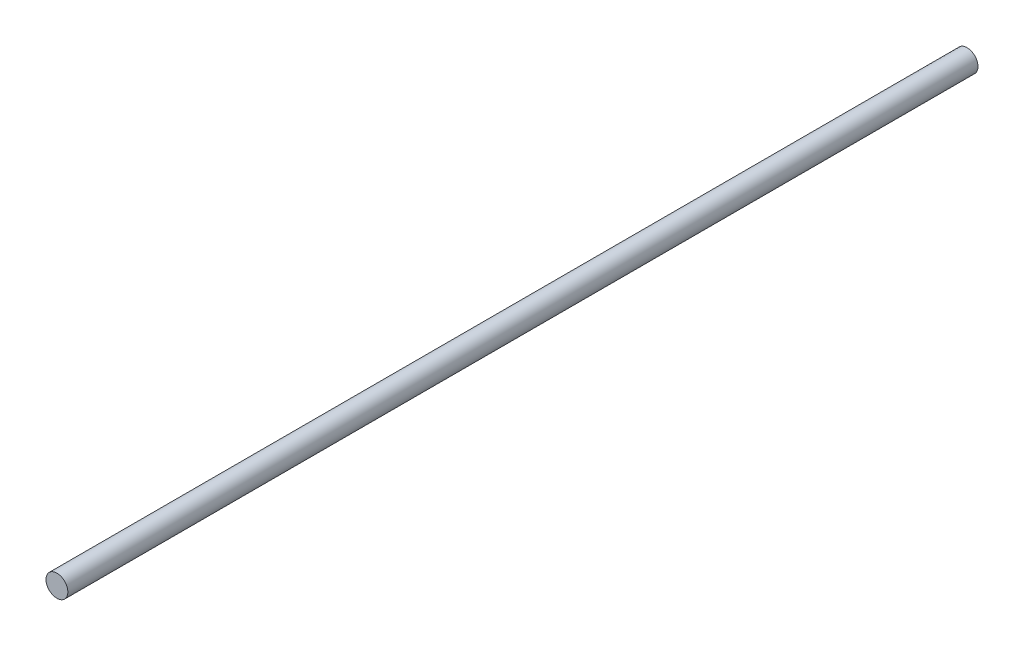
ISO-10303-21;
HEADER;
FILE_DESCRIPTION(('STEP AP214'),'2;1');
FILE_NAME('part.step','',(''),(''),'','','');
FILE_SCHEMA(('AUTOMOTIVE_DESIGN { 1 0 10303 214 1 1 1 1 }'));
ENDSEC;
DATA;
#1=APPLICATION_CONTEXT('core data for automotive mechanical design processes');
#2=APPLICATION_PROTOCOL_DEFINITION('international standard','automotive_design',2000,#1);
#3=PRODUCT_CONTEXT('',#1,'mechanical');
#4=PRODUCT('Part','Part','',(#3));
#5=PRODUCT_RELATED_PRODUCT_CATEGORY('part','',(#4));
#6=PRODUCT_DEFINITION_FORMATION('','',#4);
#7=PRODUCT_DEFINITION_CONTEXT('part definition',#1,'design');
#8=PRODUCT_DEFINITION('design','',#6,#7);
#9=PRODUCT_DEFINITION_SHAPE('','',#8);
#10=(LENGTH_UNIT() NAMED_UNIT(*) SI_UNIT(.MILLI.,.METRE.));
#11=(NAMED_UNIT(*) PLANE_ANGLE_UNIT() SI_UNIT($,.RADIAN.));
#12=(NAMED_UNIT(*) SI_UNIT($,.STERADIAN.) SOLID_ANGLE_UNIT());
#13=UNCERTAINTY_MEASURE_WITH_UNIT(LENGTH_MEASURE(1.E-05),#10,'distance_accuracy_value','');
#14=(GEOMETRIC_REPRESENTATION_CONTEXT(3) GLOBAL_UNCERTAINTY_ASSIGNED_CONTEXT((#13)) GLOBAL_UNIT_ASSIGNED_CONTEXT((#10,
#11,#12)) REPRESENTATION_CONTEXT('',''));
#15=CARTESIAN_POINT('',(0.,0.,0.));
#16=DIRECTION('',(0.,0.,1.));
#17=DIRECTION('',(1.,0.,0.));
#18=AXIS2_PLACEMENT_3D('',#15,#16,#17);
#19=CARTESIAN_POINT('',(0.,0.,500.));
#20=DIRECTION('',(0.,0.,-1.));
#21=DIRECTION('',(-1.,0.,0.));
#22=AXIS2_PLACEMENT_3D('',#19,#20,#21);
#23=CYLINDRICAL_SURFACE('',#22,6.);
#24=CARTESIAN_POINT('',(0.,0.,500.));
#25=DIRECTION('',(0.,0.,1.));
#26=DIRECTION('',(1.,0.,0.));
#27=AXIS2_PLACEMENT_3D('',#24,#25,#26);
#28=CIRCLE('',#27,6.);
#29=CARTESIAN_POINT('',(6.,0.,500.));
#30=VERTEX_POINT('',#29);
#31=EDGE_CURVE('E10',#30,#30,#28,.T.);
#32=ORIENTED_EDGE('',*,*,#31,.F.);
#33=EDGE_LOOP('',(#32));
#34=FACE_BOUND('',#33,.T.);
#35=CARTESIAN_POINT('',(0.,0.,0.));
#36=DIRECTION('',(0.,0.,1.));
#37=DIRECTION('',(1.,0.,0.));
#38=AXIS2_PLACEMENT_3D('',#35,#36,#37);
#39=CIRCLE('',#38,6.);
#40=CARTESIAN_POINT('',(6.,0.,0.));
#41=VERTEX_POINT('',#40);
#42=EDGE_CURVE('E43',#41,#41,#39,.T.);
#43=ORIENTED_EDGE('',*,*,#42,.T.);
#44=EDGE_LOOP('',(#43));
#45=FACE_BOUND('',#44,.T.);
#46=ADVANCED_FACE('F40',(#34,#45),#23,.T.);
#47=CARTESIAN_POINT('',(0.,0.,500.));
#48=DIRECTION('',(0.,0.,1.));
#49=DIRECTION('',(1.,0.,0.));
#50=AXIS2_PLACEMENT_3D('',#47,#48,#49);
#51=PLANE('',#50);
#52=ORIENTED_EDGE('',*,*,#31,.T.);
#53=EDGE_LOOP('',(#52));
#54=FACE_BOUND('',#53,.T.);
#55=ADVANCED_FACE('F55',(#54),#51,.T.);
#56=CARTESIAN_POINT('',(0.,0.,0.));
#57=DIRECTION('',(0.,0.,1.));
#58=DIRECTION('',(1.,0.,0.));
#59=AXIS2_PLACEMENT_3D('',#56,#57,#58);
#60=PLANE('',#59);
#61=ORIENTED_EDGE('',*,*,#42,.F.);
#62=EDGE_LOOP('',(#61));
#63=FACE_BOUND('',#62,.T.);
#64=ADVANCED_FACE('F53',(#63),#60,.F.);
#65=CLOSED_SHELL('',(#46,#55,#64));
#66=MANIFOLD_SOLID_BREP('B2',#65);
#67=ADVANCED_BREP_SHAPE_REPRESENTATION('',(#18,#66),#14);
#68=SHAPE_DEFINITION_REPRESENTATION(#9,#67);
ENDSEC;
END-ISO-10303-21;
